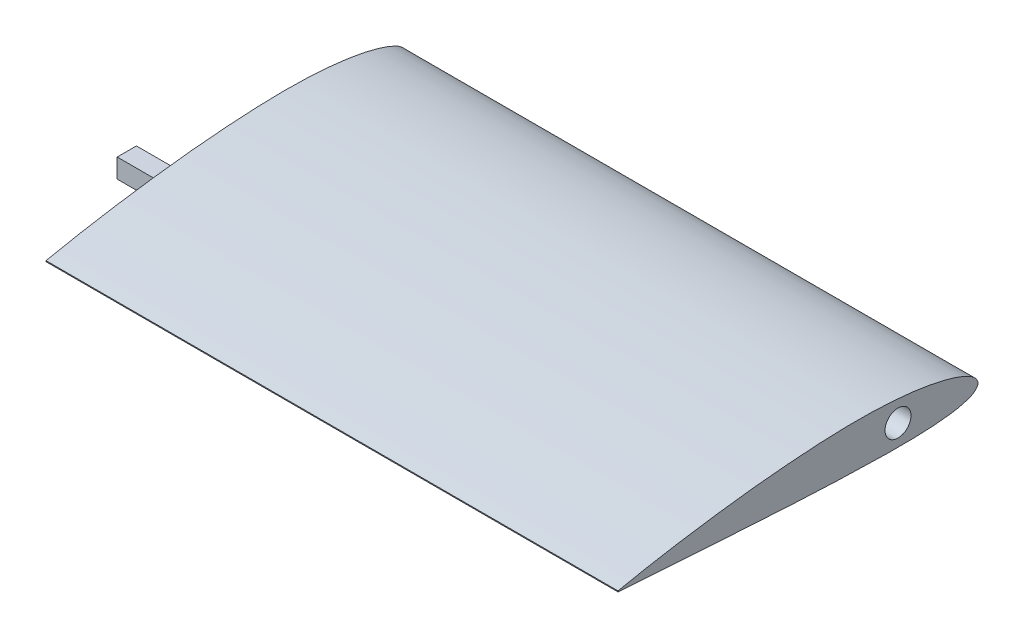
ISO-10303-21;
HEADER;
FILE_DESCRIPTION(('STEP AP214'),'2;1');
FILE_NAME('part.step','',(''),(''),'','','');
FILE_SCHEMA(('AUTOMOTIVE_DESIGN { 1 0 10303 214 1 1 1 1 }'));
ENDSEC;
DATA;
#1=APPLICATION_CONTEXT('core data for automotive mechanical design processes');
#2=APPLICATION_PROTOCOL_DEFINITION('international standard','automotive_design',2000,#1);
#3=PRODUCT_CONTEXT('',#1,'mechanical');
#4=PRODUCT('Part','Part','',(#3));
#5=PRODUCT_RELATED_PRODUCT_CATEGORY('part','',(#4));
#6=PRODUCT_DEFINITION_FORMATION('','',#4);
#7=PRODUCT_DEFINITION_CONTEXT('part definition',#1,'design');
#8=PRODUCT_DEFINITION('design','',#6,#7);
#9=PRODUCT_DEFINITION_SHAPE('','',#8);
#10=(LENGTH_UNIT() NAMED_UNIT(*) SI_UNIT(.MILLI.,.METRE.));
#11=(NAMED_UNIT(*) PLANE_ANGLE_UNIT() SI_UNIT($,.RADIAN.));
#12=(NAMED_UNIT(*) SI_UNIT($,.STERADIAN.) SOLID_ANGLE_UNIT());
#13=UNCERTAINTY_MEASURE_WITH_UNIT(LENGTH_MEASURE(1.E-05),#10,'distance_accuracy_value','');
#14=(GEOMETRIC_REPRESENTATION_CONTEXT(3) GLOBAL_UNCERTAINTY_ASSIGNED_CONTEXT((#13)) GLOBAL_UNIT_ASSIGNED_CONTEXT((#10,
#11,#12)) REPRESENTATION_CONTEXT('',''));
#15=CARTESIAN_POINT('',(0.,0.,0.));
#16=DIRECTION('',(0.,0.,1.));
#17=DIRECTION('',(1.,0.,0.));
#18=AXIS2_PLACEMENT_3D('',#15,#16,#17);
#19=CARTESIAN_POINT('',(-223.,21.9066393458341,0.0898082584499967));
#20=DIRECTION('',(1.,0.,0.));
#21=DIRECTION('',(0.,0.,-1.));
#22=AXIS2_PLACEMENT_3D('',#19,#20,#21);
#23=PLANE('',#22);
#24=CARTESIAN_POINT('',(-223.,21.4323662432829,90.));
#25=CARTESIAN_POINT('',(-223.,21.7395453735164,88.5009339259648));
#26=CARTESIAN_POINT('',(-223.,22.3530968521773,85.5067389569377));
#27=CARTESIAN_POINT('',(-223.,23.4769009739327,79.5132070250295));
#28=CARTESIAN_POINT('',(-223.,24.7220768679953,72.0172549020665));
#29=CARTESIAN_POINT('',(-223.,26.0108035511243,63.0161594976841));
#30=CARTESIAN_POINT('',(-223.,27.0855539847585,54.0165489010127));
#31=CARTESIAN_POINT('',(-223.,27.8725023386409,45.0130366232361));
#32=CARTESIAN_POINT('',(-223.,28.4054210980569,36.0115747531414));
#33=CARTESIAN_POINT('',(-223.,28.4956283216556,28.5013825090026));
#34=CARTESIAN_POINT('',(-223.,28.2471424177953,22.4991480564598));
#35=CARTESIAN_POINT('',(-223.,27.8830387632402,17.9937913398135));
#36=CARTESIAN_POINT('',(-223.,27.3064569381922,13.4827466610456));
#37=CARTESIAN_POINT('',(-223.,26.5964410206564,9.7284358411352));
#38=CARTESIAN_POINT('',(-223.,25.7931618084987,6.73542557773655));
#39=CARTESIAN_POINT('',(-223.,25.0628621788086,4.46630110284185));
#40=CARTESIAN_POINT('',(-223.,24.2119534219819,2.543789770691));
#41=CARTESIAN_POINT('',(-223.,23.1803206796216,0.88544887639786));
#42=CARTESIAN_POINT('',(-223.,21.3962581054763,-0.560680660518415));
#43=CARTESIAN_POINT('',(-223.,19.828099306194,0.941462623926129));
#44=CARTESIAN_POINT('',(-223.,19.1128759355664,2.56878461221583));
#45=CARTESIAN_POINT('',(-223.,18.5695879239883,4.48283790204994));
#46=CARTESIAN_POINT('',(-223.,18.1800489520533,6.74449178966805));
#47=CARTESIAN_POINT('',(-223.,17.8476208307239,9.74948066666687));
#48=CARTESIAN_POINT('',(-223.,17.591755210336,13.5004363160743));
#49=CARTESIAN_POINT('',(-223.,17.4891711460737,18.0043672362339));
#50=CARTESIAN_POINT('',(-223.,17.503466580105,22.5050836996857));
#51=CARTESIAN_POINT('',(-223.,17.6359103895328,28.5052315345405));
#52=CARTESIAN_POINT('',(-223.,17.8742353776701,36.0061164796125));
#53=CARTESIAN_POINT('',(-223.,18.2889930821133,45.0060655157111));
#54=CARTESIAN_POINT('',(-223.,18.8280750549617,54.0034048422384));
#55=CARTESIAN_POINT('',(-223.,19.3884076073586,63.002270200824));
#56=CARTESIAN_POINT('',(-223.,19.9555851579576,72.0026742101379));
#57=CARTESIAN_POINT('',(-223.,20.4779531958413,79.5005431049559));
#58=CARTESIAN_POINT('',(-223.,20.88086522472,85.5006876811084));
#59=CARTESIAN_POINT('',(-223.,21.0925383354339,88.5001605661209));
#60=CARTESIAN_POINT('',(-223.,21.1983821589026,90.));
#61=B_SPLINE_CURVE_WITH_KNOTS('',3,(#24,#25,#26,#27,#28,#29,#30,#31,#32,#33,#34,#35,#36,#37,#38,
#39,#40,#41,#42,#43,#44,#45,#46,#47,#48,#49,#50,#51,#52,#53,#54,#55,#56,#57,#58,#59,#60),
.UNSPECIFIED.,.F.,.F.,(4,1,1,1,1,1,1,1,1,1,1,1,1,1,1,1,1,1,1,1,1,1,1,1,1,1,1,1,1,1,1,1,1,1,4),
(0.,0.0250124897498648,0.0499592861642578,0.0996729249269686,0.149206319909966,
0.198581096615965,0.247805170456833,0.296916574601493,0.345952721793533,0.370491625569911,
0.395091203654929,0.41981479582396,0.444798575016595,0.457489818915221,0.47040640543549,
0.483879408669829,0.491264120322896,0.503458853294665,0.513609129403887,0.520450990700287,
0.533235387615153,0.545691039147803,0.558031884237173,0.582609167247894,0.607134741746914,
0.631652079836766,0.656174271859652,0.705233949250519,0.754320378530032,0.803437363555032,
0.852566095729537,0.901700994033255,0.950848809337271,0.975422716989279,1.),.UNSPECIFIED.);
#62=CARTESIAN_POINT('',(-223.,21.4323662432829,90.));
#63=VERTEX_POINT('',#62);
#64=CARTESIAN_POINT('',(-223.,21.1983821589026,90.));
#65=VERTEX_POINT('',#64);
#66=EDGE_CURVE('E169',#63,#65,#61,.T.);
#67=ORIENTED_EDGE('',*,*,#66,.T.);
#68=DIRECTION('',(0.,1.,0.));
#69=VECTOR('',#68,1.);
#70=CARTESIAN_POINT('',(-223.,21.4323662432829,90.));
#71=LINE('',#70,#69);
#72=EDGE_CURVE('E175',#65,#63,#71,.T.);
#73=ORIENTED_EDGE('',*,*,#72,.T.);
#74=EDGE_LOOP('',(#67,#73));
#75=FACE_BOUND('',#74,.T.);
#76=CARTESIAN_POINT('',(-223.,22.7683278000442,20.));
#77=DIRECTION('',(1.,0.,0.));
#78=DIRECTION('',(0.,0.,-1.));
#79=AXIS2_PLACEMENT_3D('',#76,#77,#78);
#80=CIRCLE('',#79,3.25);
#81=CARTESIAN_POINT('',(-223.,22.7683278000442,16.75));
#82=VERTEX_POINT('',#81);
#83=EDGE_CURVE('E131',#82,#82,#80,.T.);
#84=ORIENTED_EDGE('',*,*,#83,.T.);
#85=EDGE_LOOP('',(#84));
#86=FACE_BOUND('',#85,.T.);
#87=DIRECTION('',(0.,-1.,0.));
#88=VECTOR('',#87,1.);
#89=CARTESIAN_POINT('',(-223.,20.3683278000442,57.6));
#90=LINE('',#89,#88);
#91=CARTESIAN_POINT('',(-223.,25.1683278000442,57.6));
#92=VERTEX_POINT('',#91);
#93=CARTESIAN_POINT('',(-223.,20.3683278000442,57.6));
#94=VERTEX_POINT('',#93);
#95=EDGE_CURVE('E128',#92,#94,#90,.T.);
#96=ORIENTED_EDGE('',*,*,#95,.F.);
#97=DIRECTION('',(0.,0.,-1.));
#98=VECTOR('',#97,1.);
#99=CARTESIAN_POINT('',(-223.,25.1683278000442,57.6));
#100=LINE('',#99,#98);
#101=CARTESIAN_POINT('',(-223.,25.1683278000442,62.4));
#102=VERTEX_POINT('',#101);
#103=EDGE_CURVE('E125',#102,#92,#100,.T.);
#104=ORIENTED_EDGE('',*,*,#103,.F.);
#105=DIRECTION('',(0.,1.,0.));
#106=VECTOR('',#105,1.);
#107=CARTESIAN_POINT('',(-223.,25.1683278000442,62.4));
#108=LINE('',#107,#106);
#109=CARTESIAN_POINT('',(-223.,20.3683278000442,62.4));
#110=VERTEX_POINT('',#109);
#111=EDGE_CURVE('E76',#110,#102,#108,.T.);
#112=ORIENTED_EDGE('',*,*,#111,.F.);
#113=DIRECTION('',(0.,0.,1.));
#114=VECTOR('',#113,1.);
#115=CARTESIAN_POINT('',(-223.,20.3683278000442,62.4));
#116=LINE('',#115,#114);
#117=EDGE_CURVE('E71',#94,#110,#116,.T.);
#118=ORIENTED_EDGE('',*,*,#117,.F.);
#119=EDGE_LOOP('',(#96,#104,#112,#118));
#120=FACE_BOUND('',#119,.T.);
#121=ADVANCED_FACE('F55',(#75,#86,#120),#23,.F.);
#122=CARTESIAN_POINT('',(0.,0.,90.));
#123=DIRECTION('',(0.,0.,1.));
#124=DIRECTION('',(1.,0.,0.));
#125=AXIS2_PLACEMENT_3D('',#122,#123,#124);
#126=PLANE('',#125);
#127=DIRECTION('',(0.,-1.,0.));
#128=VECTOR('',#127,1.);
#129=CARTESIAN_POINT('',(-80.,0.,90.));
#130=LINE('',#129,#128);
#131=CARTESIAN_POINT('',(-80.,21.4323662432829,90.));
#132=VERTEX_POINT('',#131);
#133=CARTESIAN_POINT('',(-80.,21.1983821589026,90.));
#134=VERTEX_POINT('',#133);
#135=EDGE_CURVE('E138',#132,#134,#130,.T.);
#136=ORIENTED_EDGE('',*,*,#135,.F.);
#137=DIRECTION('',(1.,0.,0.));
#138=VECTOR('',#137,1.);
#139=CARTESIAN_POINT('',(-223.,21.4323662432829,90.));
#140=LINE('',#139,#138);
#141=EDGE_CURVE('E181',#63,#132,#140,.T.);
#142=ORIENTED_EDGE('',*,*,#141,.F.);
#143=ORIENTED_EDGE('',*,*,#72,.F.);
#144=DIRECTION('',(1.,0.,0.));
#145=VECTOR('',#144,1.);
#146=CARTESIAN_POINT('',(-223.,21.1983821589026,90.));
#147=LINE('',#146,#145);
#148=EDGE_CURVE('E64',#65,#134,#147,.T.);
#149=ORIENTED_EDGE('',*,*,#148,.T.);
#150=EDGE_LOOP('',(#136,#142,#143,#149));
#151=FACE_BOUND('',#150,.T.);
#152=ADVANCED_FACE('F57',(#151),#126,.T.);
#153=DIRECTION('',(1.,0.,0.));
#154=VECTOR('',#153,1.);
#155=SURFACE_OF_LINEAR_EXTRUSION('',#61,#154);
#156=CARTESIAN_POINT('',(-80.,21.1983821589026,90.));
#157=CARTESIAN_POINT('',(-80.,21.0925383354339,88.5001605661209));
#158=CARTESIAN_POINT('',(-80.,20.88086522472,85.5006876811084));
#159=CARTESIAN_POINT('',(-80.,20.4779531958413,79.5005431049559));
#160=CARTESIAN_POINT('',(-80.,19.9555851579576,72.0026742101379));
#161=CARTESIAN_POINT('',(-80.,19.3884076073586,63.002270200824));
#162=CARTESIAN_POINT('',(-80.,18.8280750549617,54.0034048422384));
#163=CARTESIAN_POINT('',(-80.,18.2889930821133,45.0060655157111));
#164=CARTESIAN_POINT('',(-80.,17.8742353776701,36.0061164796125));
#165=CARTESIAN_POINT('',(-80.,17.6359103895328,28.5052315345405));
#166=CARTESIAN_POINT('',(-80.,17.503466580105,22.5050836996857));
#167=CARTESIAN_POINT('',(-80.,17.4891711460737,18.0043672362339));
#168=CARTESIAN_POINT('',(-80.,17.591755210336,13.5004363160743));
#169=CARTESIAN_POINT('',(-80.,17.8476208307239,9.74948066666687));
#170=CARTESIAN_POINT('',(-80.,18.1800489520533,6.74449178966805));
#171=CARTESIAN_POINT('',(-80.,18.5695879239883,4.48283790204994));
#172=CARTESIAN_POINT('',(-80.,19.1128759355664,2.56878461221583));
#173=CARTESIAN_POINT('',(-80.,19.828099306194,0.941462623926129));
#174=CARTESIAN_POINT('',(-80.,21.3962581054763,-0.560680660518415));
#175=CARTESIAN_POINT('',(-80.,23.1803206796216,0.88544887639786));
#176=CARTESIAN_POINT('',(-80.,24.2119534219819,2.543789770691));
#177=CARTESIAN_POINT('',(-80.,25.0628621788086,4.46630110284185));
#178=CARTESIAN_POINT('',(-80.,25.7931618084987,6.73542557773655));
#179=CARTESIAN_POINT('',(-80.,26.5964410206564,9.7284358411352));
#180=CARTESIAN_POINT('',(-80.,27.3064569381922,13.4827466610456));
#181=CARTESIAN_POINT('',(-80.,27.8830387632402,17.9937913398135));
#182=CARTESIAN_POINT('',(-80.,28.2471424177953,22.4991480564598));
#183=CARTESIAN_POINT('',(-80.,28.4956283216556,28.5013825090026));
#184=CARTESIAN_POINT('',(-80.,28.4054210980569,36.0115747531414));
#185=CARTESIAN_POINT('',(-80.,27.8725023386409,45.0130366232361));
#186=CARTESIAN_POINT('',(-80.,27.0855539847585,54.0165489010127));
#187=CARTESIAN_POINT('',(-80.,26.0108035511243,63.0161594976841));
#188=CARTESIAN_POINT('',(-80.,24.7220768679953,72.0172549020665));
#189=CARTESIAN_POINT('',(-80.,23.4769009739327,79.5132070250295));
#190=CARTESIAN_POINT('',(-80.,22.3530968521773,85.5067389569377));
#191=CARTESIAN_POINT('',(-80.,21.7395453735164,88.5009339259648));
#192=CARTESIAN_POINT('',(-80.,21.4323662432829,90.));
#193=B_SPLINE_CURVE_WITH_KNOTS('',3,(#156,#157,#158,#159,#160,#161,#162,#163,#164,#165,#166,
#167,#168,#169,#170,#171,#172,#173,#174,#175,#176,#177,#178,#179,#180,#181,#182,#183,#184,#185,
#186,#187,#188,#189,#190,#191,#192),.UNSPECIFIED.,.F.,.F.,(4,1,1,1,1,1,1,1,1,1,1,1,1,1,1,1,1,1,
1,1,1,1,1,1,1,1,1,1,1,1,1,1,1,1,4),(0.,0.0245772830107215,0.0491511906627294,0.0982990059667455,
0.147433904270463,0.196562636444968,0.245679621469968,0.294766050749481,0.343825728140348,
0.368347920163234,0.392865258253086,0.417390832752106,0.441968115762827,0.454308960852197,
0.466764612384847,0.479549009299713,0.486390870596113,0.496541146705335,0.508735879677104,
0.516120591330171,0.52959359456451,0.542510181084779,0.555201424983405,0.58018520417604,
0.604908796345071,0.629508374430089,0.654047278206467,0.703083425398507,0.752194829543167,
0.801418903384035,0.850793680090034,0.900327075073031,0.950040713835742,0.974987510250135,1.),.UNSPECIFIED.);
#194=EDGE_CURVE('E12',#134,#132,#193,.T.);
#195=ORIENTED_EDGE('',*,*,#194,.F.);
#196=ORIENTED_EDGE('',*,*,#148,.F.);
#197=ORIENTED_EDGE('',*,*,#66,.F.);
#198=ORIENTED_EDGE('',*,*,#141,.T.);
#199=EDGE_LOOP('',(#195,#196,#197,#198));
#200=FACE_BOUND('',#199,.T.);
#201=ADVANCED_FACE('F159',(#200),#155,.F.);
#202=CARTESIAN_POINT('',(-80.,0.,0.));
#203=DIRECTION('',(-1.,0.,0.));
#204=DIRECTION('',(0.,0.,1.));
#205=AXIS2_PLACEMENT_3D('',#202,#203,#204);
#206=PLANE('',#205);
#207=CARTESIAN_POINT('',(-80.,22.7683278000442,20.));
#208=DIRECTION('',(-1.,0.,0.));
#209=DIRECTION('',(0.,0.,1.));
#210=AXIS2_PLACEMENT_3D('',#207,#208,#209);
#211=CIRCLE('',#210,3.25);
#212=CARTESIAN_POINT('',(-80.,22.7683278000442,23.25));
#213=VERTEX_POINT('',#212);
#214=EDGE_CURVE('E59',#213,#213,#211,.T.);
#215=ORIENTED_EDGE('',*,*,#214,.T.);
#216=EDGE_LOOP('',(#215));
#217=FACE_BOUND('',#216,.T.);
#218=ORIENTED_EDGE('',*,*,#135,.T.);
#219=ORIENTED_EDGE('',*,*,#194,.T.);
#220=EDGE_LOOP('',(#218,#219));
#221=FACE_BOUND('',#220,.T.);
#222=ADVANCED_FACE('F148',(#217,#221),#206,.F.);
#223=CARTESIAN_POINT('',(-79.9749585660652,22.7683278000442,20.));
#224=DIRECTION('',(-1.,0.,0.));
#225=DIRECTION('',(0.,0.,1.));
#226=AXIS2_PLACEMENT_3D('',#223,#224,#225);
#227=CYLINDRICAL_SURFACE('',#226,3.25);
#228=ORIENTED_EDGE('',*,*,#214,.F.);
#229=EDGE_LOOP('',(#228));
#230=FACE_BOUND('',#229,.T.);
#231=ORIENTED_EDGE('',*,*,#83,.F.);
#232=EDGE_LOOP('',(#231));
#233=FACE_BOUND('',#232,.T.);
#234=ADVANCED_FACE('F158',(#230,#233),#227,.F.);
#235=CARTESIAN_POINT('',(-232.8,20.3683278000442,57.6));
#236=DIRECTION('',(0.,0.,1.));
#237=DIRECTION('',(1.,0.,0.));
#238=AXIS2_PLACEMENT_3D('',#235,#236,#237);
#239=PLANE('',#238);
#240=ORIENTED_EDGE('',*,*,#95,.T.);
#241=DIRECTION('',(1.,0.,0.));
#242=VECTOR('',#241,1.);
#243=CARTESIAN_POINT('',(-232.8,20.3683278000442,57.6));
#244=LINE('',#243,#242);
#245=CARTESIAN_POINT('',(-232.8,20.3683278000442,57.6));
#246=VERTEX_POINT('',#245);
#247=EDGE_CURVE('E109',#246,#94,#244,.T.);
#248=ORIENTED_EDGE('',*,*,#247,.F.);
#249=DIRECTION('',(0.,-1.,0.));
#250=VECTOR('',#249,1.);
#251=CARTESIAN_POINT('',(-232.8,20.3683278000442,57.6));
#252=LINE('',#251,#250);
#253=CARTESIAN_POINT('',(-232.8,25.1683278000442,57.6));
#254=VERTEX_POINT('',#253);
#255=EDGE_CURVE('E116',#254,#246,#252,.T.);
#256=ORIENTED_EDGE('',*,*,#255,.F.);
#257=DIRECTION('',(1.,0.,0.));
#258=VECTOR('',#257,1.);
#259=CARTESIAN_POINT('',(-232.8,25.1683278000442,57.6));
#260=LINE('',#259,#258);
#261=EDGE_CURVE('E215',#254,#92,#260,.T.);
#262=ORIENTED_EDGE('',*,*,#261,.T.);
#263=EDGE_LOOP('',(#240,#248,#256,#262));
#264=FACE_BOUND('',#263,.T.);
#265=ADVANCED_FACE('F127',(#264),#239,.F.);
#266=CARTESIAN_POINT('',(-232.8,20.3683278000442,62.4));
#267=DIRECTION('',(0.,1.,0.));
#268=DIRECTION('',(0.,0.,1.));
#269=AXIS2_PLACEMENT_3D('',#266,#267,#268);
#270=PLANE('',#269);
#271=ORIENTED_EDGE('',*,*,#117,.T.);
#272=DIRECTION('',(1.,0.,0.));
#273=VECTOR('',#272,1.);
#274=CARTESIAN_POINT('',(-232.8,20.3683278000442,62.4));
#275=LINE('',#274,#273);
#276=CARTESIAN_POINT('',(-232.8,20.3683278000442,62.4));
#277=VERTEX_POINT('',#276);
#278=EDGE_CURVE('E112',#277,#110,#275,.T.);
#279=ORIENTED_EDGE('',*,*,#278,.F.);
#280=DIRECTION('',(0.,0.,1.));
#281=VECTOR('',#280,1.);
#282=CARTESIAN_POINT('',(-232.8,20.3683278000442,62.4));
#283=LINE('',#282,#281);
#284=EDGE_CURVE('E105',#246,#277,#283,.T.);
#285=ORIENTED_EDGE('',*,*,#284,.F.);
#286=ORIENTED_EDGE('',*,*,#247,.T.);
#287=EDGE_LOOP('',(#271,#279,#285,#286));
#288=FACE_BOUND('',#287,.T.);
#289=ADVANCED_FACE('F107',(#288),#270,.F.);
#290=CARTESIAN_POINT('',(-232.8,25.1683278000442,62.4));
#291=DIRECTION('',(0.,0.,-1.));
#292=DIRECTION('',(-1.,0.,0.));
#293=AXIS2_PLACEMENT_3D('',#290,#291,#292);
#294=PLANE('',#293);
#295=ORIENTED_EDGE('',*,*,#111,.T.);
#296=DIRECTION('',(1.,0.,0.));
#297=VECTOR('',#296,1.);
#298=CARTESIAN_POINT('',(-232.8,25.1683278000442,62.4));
#299=LINE('',#298,#297);
#300=CARTESIAN_POINT('',(-232.8,25.1683278000442,62.4));
#301=VERTEX_POINT('',#300);
#302=EDGE_CURVE('E132',#301,#102,#299,.T.);
#303=ORIENTED_EDGE('',*,*,#302,.F.);
#304=DIRECTION('',(0.,1.,0.));
#305=VECTOR('',#304,1.);
#306=CARTESIAN_POINT('',(-232.8,25.1683278000442,62.4));
#307=LINE('',#306,#305);
#308=EDGE_CURVE('E115',#277,#301,#307,.T.);
#309=ORIENTED_EDGE('',*,*,#308,.F.);
#310=ORIENTED_EDGE('',*,*,#278,.T.);
#311=EDGE_LOOP('',(#295,#303,#309,#310));
#312=FACE_BOUND('',#311,.T.);
#313=ADVANCED_FACE('F224',(#312),#294,.F.);
#314=CARTESIAN_POINT('',(-232.8,25.1683278000442,57.6));
#315=DIRECTION('',(0.,-1.,0.));
#316=DIRECTION('',(0.,0.,-1.));
#317=AXIS2_PLACEMENT_3D('',#314,#315,#316);
#318=PLANE('',#317);
#319=ORIENTED_EDGE('',*,*,#103,.T.);
#320=ORIENTED_EDGE('',*,*,#261,.F.);
#321=DIRECTION('',(0.,0.,-1.));
#322=VECTOR('',#321,1.);
#323=CARTESIAN_POINT('',(-232.8,25.1683278000442,57.6));
#324=LINE('',#323,#322);
#325=EDGE_CURVE('E121',#301,#254,#324,.T.);
#326=ORIENTED_EDGE('',*,*,#325,.F.);
#327=ORIENTED_EDGE('',*,*,#302,.T.);
#328=EDGE_LOOP('',(#319,#320,#326,#327));
#329=FACE_BOUND('',#328,.T.);
#330=ADVANCED_FACE('F214',(#329),#318,.F.);
#331=CARTESIAN_POINT('',(-232.8,0.,0.));
#332=DIRECTION('',(1.,0.,0.));
#333=DIRECTION('',(0.,0.,-1.));
#334=AXIS2_PLACEMENT_3D('',#331,#332,#333);
#335=PLANE('',#334);
#336=ORIENTED_EDGE('',*,*,#255,.T.);
#337=ORIENTED_EDGE('',*,*,#284,.T.);
#338=ORIENTED_EDGE('',*,*,#308,.T.);
#339=ORIENTED_EDGE('',*,*,#325,.T.);
#340=EDGE_LOOP('',(#336,#337,#338,#339));
#341=FACE_BOUND('',#340,.T.);
#342=ADVANCED_FACE('F119',(#341),#335,.F.);
#343=CLOSED_SHELL('',(#121,#152,#201,#222,#234,#265,#289,#313,#330,#342));
#344=MANIFOLD_SOLID_BREP('B2',#343);
#345=ADVANCED_BREP_SHAPE_REPRESENTATION('',(#18,#344),#14);
#346=SHAPE_DEFINITION_REPRESENTATION(#9,#345);
ENDSEC;
END-ISO-10303-21;
